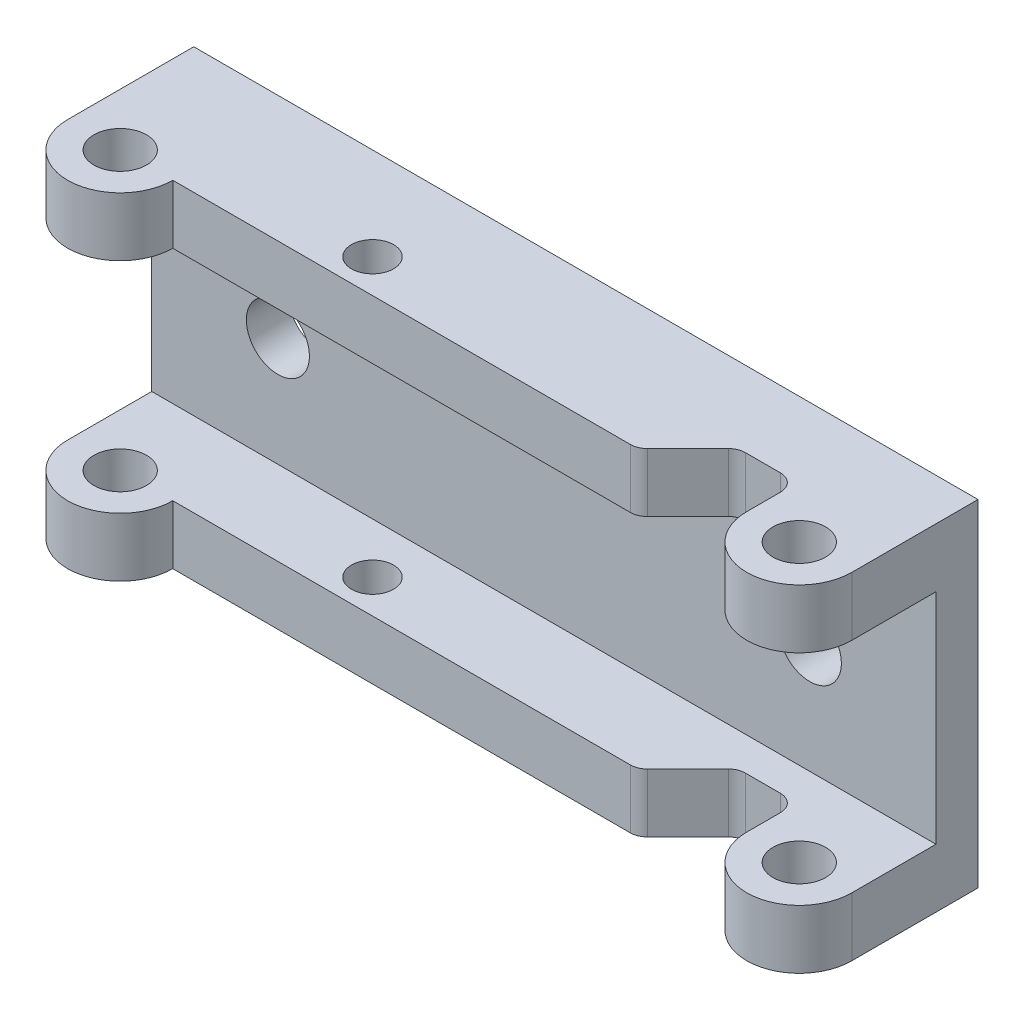
ISO-10303-21;
HEADER;
FILE_DESCRIPTION(('STEP AP214'),'2;1');
FILE_NAME('part.step','',(''),(''),'','','');
FILE_SCHEMA(('AUTOMOTIVE_DESIGN { 1 0 10303 214 1 1 1 1 }'));
ENDSEC;
DATA;
#1=APPLICATION_CONTEXT('core data for automotive mechanical design processes');
#2=APPLICATION_PROTOCOL_DEFINITION('international standard','automotive_design',2000,#1);
#3=PRODUCT_CONTEXT('',#1,'mechanical');
#4=PRODUCT('Part','Part','',(#3));
#5=PRODUCT_RELATED_PRODUCT_CATEGORY('part','',(#4));
#6=PRODUCT_DEFINITION_FORMATION('','',#4);
#7=PRODUCT_DEFINITION_CONTEXT('part definition',#1,'design');
#8=PRODUCT_DEFINITION('design','',#6,#7);
#9=PRODUCT_DEFINITION_SHAPE('','',#8);
#10=(LENGTH_UNIT() NAMED_UNIT(*) SI_UNIT(.MILLI.,.METRE.));
#11=(NAMED_UNIT(*) PLANE_ANGLE_UNIT() SI_UNIT($,.RADIAN.));
#12=(NAMED_UNIT(*) SI_UNIT($,.STERADIAN.) SOLID_ANGLE_UNIT());
#13=UNCERTAINTY_MEASURE_WITH_UNIT(LENGTH_MEASURE(1.E-05),#10,'distance_accuracy_value','');
#14=(GEOMETRIC_REPRESENTATION_CONTEXT(3) GLOBAL_UNCERTAINTY_ASSIGNED_CONTEXT((#13)) GLOBAL_UNIT_ASSIGNED_CONTEXT((#10,
#11,#12)) REPRESENTATION_CONTEXT('',''));
#15=CARTESIAN_POINT('',(0.,0.,0.));
#16=DIRECTION('',(0.,0.,1.));
#17=DIRECTION('',(1.,0.,0.));
#18=AXIS2_PLACEMENT_3D('',#15,#16,#17);
#19=CARTESIAN_POINT('',(118.4275,0.,0.));
#20=DIRECTION('',(1.,0.,0.));
#21=DIRECTION('',(0.,0.,-1.));
#22=AXIS2_PLACEMENT_3D('',#19,#20,#21);
#23=PLANE('',#22);
#24=DIRECTION('',(0.,0.,1.));
#25=VECTOR('',#24,1.);
#26=CARTESIAN_POINT('',(118.4275,25.4,0.));
#27=LINE('',#26,#25);
#28=CARTESIAN_POINT('',(118.4275,25.4,0.));
#29=VERTEX_POINT('',#28);
#30=CARTESIAN_POINT('',(118.4275,25.4,19.05));
#31=VERTEX_POINT('',#30);
#32=EDGE_CURVE('E423',#29,#31,#27,.T.);
#33=ORIENTED_EDGE('',*,*,#32,.T.);
#34=DIRECTION('',(0.,1.,0.));
#35=VECTOR('',#34,1.);
#36=CARTESIAN_POINT('',(118.4275,-154.769075347434,19.05));
#37=LINE('',#36,#35);
#38=CARTESIAN_POINT('',(118.4275,16.51,19.05));
#39=VERTEX_POINT('',#38);
#40=EDGE_CURVE('E12',#31,#39,#37,.F.);
#41=ORIENTED_EDGE('',*,*,#40,.T.);
#42=DIRECTION('',(0.,0.,-1.));
#43=VECTOR('',#42,1.);
#44=CARTESIAN_POINT('',(118.4275,16.51,63.5));
#45=LINE('',#44,#43);
#46=CARTESIAN_POINT('',(118.4275,16.51,6.35));
#47=VERTEX_POINT('',#46);
#48=EDGE_CURVE('E427',#39,#47,#45,.T.);
#49=ORIENTED_EDGE('',*,*,#48,.T.);
#50=DIRECTION('',(0.,-1.,0.));
#51=VECTOR('',#50,1.);
#52=CARTESIAN_POINT('',(118.4275,16.51,6.35));
#53=LINE('',#52,#51);
#54=CARTESIAN_POINT('',(118.4275,-16.51,6.35));
#55=VERTEX_POINT('',#54);
#56=EDGE_CURVE('E431',#47,#55,#53,.T.);
#57=ORIENTED_EDGE('',*,*,#56,.T.);
#58=DIRECTION('',(0.,0.,1.));
#59=VECTOR('',#58,1.);
#60=CARTESIAN_POINT('',(118.4275,-16.51,63.5));
#61=LINE('',#60,#59);
#62=CARTESIAN_POINT('',(118.4275,-16.51,19.05));
#63=VERTEX_POINT('',#62);
#64=EDGE_CURVE('E434',#55,#63,#61,.T.);
#65=ORIENTED_EDGE('',*,*,#64,.T.);
#66=DIRECTION('',(0.,1.,0.));
#67=VECTOR('',#66,1.);
#68=CARTESIAN_POINT('',(118.4275,-154.769075347434,19.05));
#69=LINE('',#68,#67);
#70=CARTESIAN_POINT('',(118.4275,-25.4,19.05));
#71=VERTEX_POINT('',#70);
#72=EDGE_CURVE('E224',#71,#63,#69,.T.);
#73=ORIENTED_EDGE('',*,*,#72,.F.);
#74=DIRECTION('',(0.,0.,-1.));
#75=VECTOR('',#74,1.);
#76=CARTESIAN_POINT('',(118.4275,-25.4,0.));
#77=LINE('',#76,#75);
#78=CARTESIAN_POINT('',(118.4275,-25.4,0.));
#79=VERTEX_POINT('',#78);
#80=EDGE_CURVE('E438',#71,#79,#77,.T.);
#81=ORIENTED_EDGE('',*,*,#80,.T.);
#82=DIRECTION('',(0.,1.,0.));
#83=VECTOR('',#82,1.);
#84=CARTESIAN_POINT('',(118.4275,-25.4,0.));
#85=LINE('',#84,#83);
#86=EDGE_CURVE('E441',#79,#29,#85,.T.);
#87=ORIENTED_EDGE('',*,*,#86,.T.);
#88=EDGE_LOOP('',(#33,#41,#49,#57,#65,#73,#81,#87));
#89=FACE_BOUND('',#88,.T.);
#90=ADVANCED_FACE('F48',(#89),#23,.T.);
#91=CARTESIAN_POINT('',(0.,0.,0.));
#92=DIRECTION('',(1.,0.,0.));
#93=DIRECTION('',(0.,0.,-1.));
#94=AXIS2_PLACEMENT_3D('',#91,#92,#93);
#95=PLANE('',#94);
#96=DIRECTION('',(0.,1.,0.));
#97=VECTOR('',#96,1.);
#98=CARTESIAN_POINT('',(0.,-154.769075347434,19.05));
#99=LINE('',#98,#97);
#100=CARTESIAN_POINT('',(0.,25.4,19.05));
#101=VERTEX_POINT('',#100);
#102=CARTESIAN_POINT('',(0.,16.51,19.05));
#103=VERTEX_POINT('',#102);
#104=EDGE_CURVE('E57',#101,#103,#99,.F.);
#105=ORIENTED_EDGE('',*,*,#104,.F.);
#106=DIRECTION('',(0.,0.,1.));
#107=VECTOR('',#106,1.);
#108=CARTESIAN_POINT('',(0.,25.4,0.));
#109=LINE('',#108,#107);
#110=CARTESIAN_POINT('',(0.,25.4,0.));
#111=VERTEX_POINT('',#110);
#112=EDGE_CURVE('E422',#111,#101,#109,.T.);
#113=ORIENTED_EDGE('',*,*,#112,.F.);
#114=DIRECTION('',(0.,1.,0.));
#115=VECTOR('',#114,1.);
#116=CARTESIAN_POINT('',(0.,-25.4,0.));
#117=LINE('',#116,#115);
#118=CARTESIAN_POINT('',(0.,-25.4,0.));
#119=VERTEX_POINT('',#118);
#120=EDGE_CURVE('E428',#119,#111,#117,.T.);
#121=ORIENTED_EDGE('',*,*,#120,.F.);
#122=DIRECTION('',(0.,0.,-1.));
#123=VECTOR('',#122,1.);
#124=CARTESIAN_POINT('',(0.,-25.4,0.));
#125=LINE('',#124,#123);
#126=CARTESIAN_POINT('',(0.,-25.4,19.05));
#127=VERTEX_POINT('',#126);
#128=EDGE_CURVE('E458',#127,#119,#125,.T.);
#129=ORIENTED_EDGE('',*,*,#128,.F.);
#130=DIRECTION('',(0.,1.,0.));
#131=VECTOR('',#130,1.);
#132=CARTESIAN_POINT('',(0.,-154.769075347434,19.05));
#133=LINE('',#132,#131);
#134=CARTESIAN_POINT('',(0.,-16.51,19.05));
#135=VERTEX_POINT('',#134);
#136=EDGE_CURVE('E281',#127,#135,#133,.T.);
#137=ORIENTED_EDGE('',*,*,#136,.T.);
#138=DIRECTION('',(0.,0.,1.));
#139=VECTOR('',#138,1.);
#140=CARTESIAN_POINT('',(0.,-16.51,63.5));
#141=LINE('',#140,#139);
#142=CARTESIAN_POINT('',(0.,-16.51,6.35));
#143=VERTEX_POINT('',#142);
#144=EDGE_CURVE('E454',#143,#135,#141,.T.);
#145=ORIENTED_EDGE('',*,*,#144,.F.);
#146=DIRECTION('',(0.,-1.,0.));
#147=VECTOR('',#146,1.);
#148=CARTESIAN_POINT('',(0.,16.51,6.35));
#149=LINE('',#148,#147);
#150=CARTESIAN_POINT('',(0.,16.51,6.35));
#151=VERTEX_POINT('',#150);
#152=EDGE_CURVE('E451',#151,#143,#149,.T.);
#153=ORIENTED_EDGE('',*,*,#152,.F.);
#154=DIRECTION('',(0.,0.,-1.));
#155=VECTOR('',#154,1.);
#156=CARTESIAN_POINT('',(0.,16.51,63.5));
#157=LINE('',#156,#155);
#158=EDGE_CURVE('E448',#103,#151,#157,.T.);
#159=ORIENTED_EDGE('',*,*,#158,.F.);
#160=EDGE_LOOP('',(#105,#113,#121,#129,#137,#145,#153,#159));
#161=FACE_BOUND('',#160,.T.);
#162=ADVANCED_FACE('F489',(#161),#95,.F.);
#163=CARTESIAN_POINT('',(118.4275,25.4,0.));
#164=DIRECTION('',(0.,-1.,0.));
#165=DIRECTION('',(0.,0.,-1.));
#166=AXIS2_PLACEMENT_3D('',#163,#164,#165);
#167=PLANE('',#166);
#168=CARTESIAN_POINT('',(110.49,25.4,19.05));
#169=DIRECTION('',(0.,-1.,0.));
#170=DIRECTION('',(0.,0.,-1.));
#171=AXIS2_PLACEMENT_3D('',#168,#169,#170);
#172=CIRCLE('',#171,3.96875000000001);
#173=CARTESIAN_POINT('',(110.49,25.4,15.08125));
#174=VERTEX_POINT('',#173);
#175=EDGE_CURVE('E315',#174,#174,#172,.T.);
#176=ORIENTED_EDGE('',*,*,#175,.T.);
#177=EDGE_LOOP('',(#176));
#178=FACE_BOUND('',#177,.T.);
#179=CARTESIAN_POINT('',(40.9575,25.4,13.97));
#180=DIRECTION('',(0.,-1.,0.));
#181=DIRECTION('',(0.,0.,-1.));
#182=AXIS2_PLACEMENT_3D('',#179,#180,#181);
#183=CIRCLE('',#182,3.175);
#184=CARTESIAN_POINT('',(40.9575,25.4,10.795));
#185=VERTEX_POINT('',#184);
#186=EDGE_CURVE('E242',#185,#185,#183,.T.);
#187=ORIENTED_EDGE('',*,*,#186,.T.);
#188=EDGE_LOOP('',(#187));
#189=FACE_BOUND('',#188,.T.);
#190=CARTESIAN_POINT('',(7.9375,25.4,19.05));
#191=DIRECTION('',(0.,-1.,0.));
#192=DIRECTION('',(0.,0.,-1.));
#193=AXIS2_PLACEMENT_3D('',#190,#191,#192);
#194=CIRCLE('',#193,3.96875000000001);
#195=CARTESIAN_POINT('',(7.9375,25.4,15.08125));
#196=VERTEX_POINT('',#195);
#197=EDGE_CURVE('E323',#196,#196,#194,.T.);
#198=ORIENTED_EDGE('',*,*,#197,.T.);
#199=EDGE_LOOP('',(#198));
#200=FACE_BOUND('',#199,.T.);
#201=DIRECTION('',(0.,0.,1.));
#202=VECTOR('',#201,1.);
#203=CARTESIAN_POINT('',(102.5525,25.4,19.05));
#204=LINE('',#203,#202);
#205=CARTESIAN_POINT('',(102.5525,25.4,13.97));
#206=VERTEX_POINT('',#205);
#207=CARTESIAN_POINT('',(102.5525,25.4,19.05));
#208=VERTEX_POINT('',#207);
#209=EDGE_CURVE('E216',#206,#208,#204,.T.);
#210=ORIENTED_EDGE('',*,*,#209,.T.);
#211=CARTESIAN_POINT('',(110.49,25.4,19.05));
#212=DIRECTION('',(0.,-1.,0.));
#213=DIRECTION('',(0.,0.,-1.));
#214=AXIS2_PLACEMENT_3D('',#211,#212,#213);
#215=CIRCLE('',#214,7.9375);
#216=EDGE_CURVE('E227',#208,#31,#215,.F.);
#217=ORIENTED_EDGE('',*,*,#216,.T.);
#218=ORIENTED_EDGE('',*,*,#32,.F.);
#219=DIRECTION('',(-1.,0.,0.));
#220=VECTOR('',#219,1.);
#221=CARTESIAN_POINT('',(118.4275,25.4,0.));
#222=LINE('',#221,#220);
#223=EDGE_CURVE('E443',#29,#111,#222,.T.);
#224=ORIENTED_EDGE('',*,*,#223,.T.);
#225=ORIENTED_EDGE('',*,*,#112,.T.);
#226=CARTESIAN_POINT('',(7.9375,25.4,19.05));
#227=DIRECTION('',(0.,-1.,0.));
#228=DIRECTION('',(0.,0.,-1.));
#229=AXIS2_PLACEMENT_3D('',#226,#227,#228);
#230=CIRCLE('',#229,7.9375);
#231=CARTESIAN_POINT('',(15.875,25.4,19.05));
#232=VERTEX_POINT('',#231);
#233=EDGE_CURVE('E72',#101,#232,#230,.F.);
#234=ORIENTED_EDGE('',*,*,#233,.T.);
#235=DIRECTION('',(1.,0.,0.));
#236=VECTOR('',#235,1.);
#237=CARTESIAN_POINT('',(15.875,25.4,19.05));
#238=LINE('',#237,#236);
#239=CARTESIAN_POINT('',(84.9903975515723,25.4,19.05));
#240=VERTEX_POINT('',#239);
#241=EDGE_CURVE('E526',#232,#240,#238,.T.);
#242=ORIENTED_EDGE('',*,*,#241,.T.);
#243=CARTESIAN_POINT('',(84.9903975515723,25.4,16.51));
#244=DIRECTION('',(0.,-1.,0.));
#245=DIRECTION('',(0.,0.,-1.));
#246=AXIS2_PLACEMENT_3D('',#243,#244,#245);
#247=CIRCLE('',#246,2.54000000000001);
#248=CARTESIAN_POINT('',(86.7864487757861,25.4,18.3060512242138));
#249=VERTEX_POINT('',#248);
#250=EDGE_CURVE('E522',#240,#249,#247,.F.);
#251=ORIENTED_EDGE('',*,*,#250,.T.);
#252=DIRECTION('',(0.707106781186551,0.,-0.707106781186544));
#253=VECTOR('',#252,1.);
#254=CARTESIAN_POINT('',(86.7864487757861,25.4,18.3060512242138));
#255=LINE('',#254,#253);
#256=CARTESIAN_POINT('',(92.9185512242138,25.4,12.1739487757862));
#257=VERTEX_POINT('',#256);
#258=EDGE_CURVE('E518',#249,#257,#255,.T.);
#259=ORIENTED_EDGE('',*,*,#258,.T.);
#260=CARTESIAN_POINT('',(94.7146024484277,25.4,13.97));
#261=DIRECTION('',(0.,-1.,0.));
#262=DIRECTION('',(0.,0.,-1.));
#263=AXIS2_PLACEMENT_3D('',#260,#261,#262);
#264=CIRCLE('',#263,2.54);
#265=CARTESIAN_POINT('',(94.7146024484277,25.4,11.43));
#266=VERTEX_POINT('',#265);
#267=EDGE_CURVE('E515',#257,#266,#264,.T.);
#268=ORIENTED_EDGE('',*,*,#267,.T.);
#269=DIRECTION('',(1.,0.,0.));
#270=VECTOR('',#269,1.);
#271=CARTESIAN_POINT('',(100.0125,25.4,11.43));
#272=LINE('',#271,#270);
#273=CARTESIAN_POINT('',(100.0125,25.4,11.43));
#274=VERTEX_POINT('',#273);
#275=EDGE_CURVE('E513',#266,#274,#272,.T.);
#276=ORIENTED_EDGE('',*,*,#275,.T.);
#277=CARTESIAN_POINT('',(100.0125,25.4,13.97));
#278=DIRECTION('',(0.,-1.,0.));
#279=DIRECTION('',(0.,0.,-1.));
#280=AXIS2_PLACEMENT_3D('',#277,#278,#279);
#281=CIRCLE('',#280,2.54);
#282=EDGE_CURVE('E236',#274,#206,#281,.T.);
#283=ORIENTED_EDGE('',*,*,#282,.T.);
#284=EDGE_LOOP('',(#210,#217,#218,#224,#225,#234,#242,#251,#259,#268,#276,#283));
#285=FACE_BOUND('',#284,.T.);
#286=ADVANCED_FACE('F50',(#178,#189,#200,#285),#167,.F.);
#287=CARTESIAN_POINT('',(118.4275,16.51,63.5));
#288=DIRECTION('',(0.,1.,0.));
#289=DIRECTION('',(0.,0.,1.));
#290=AXIS2_PLACEMENT_3D('',#287,#288,#289);
#291=PLANE('',#290);
#292=ORIENTED_EDGE('',*,*,#48,.F.);
#293=CARTESIAN_POINT('',(110.49,16.51,19.05));
#294=DIRECTION('',(0.,1.,0.));
#295=DIRECTION('',(0.,0.,1.));
#296=AXIS2_PLACEMENT_3D('',#293,#294,#295);
#297=CIRCLE('',#296,7.9375);
#298=CARTESIAN_POINT('',(102.5525,16.51,19.05));
#299=VERTEX_POINT('',#298);
#300=EDGE_CURVE('E341',#39,#299,#297,.F.);
#301=ORIENTED_EDGE('',*,*,#300,.T.);
#302=DIRECTION('',(0.,0.,-1.));
#303=VECTOR('',#302,1.);
#304=CARTESIAN_POINT('',(102.5525,16.51,63.5));
#305=LINE('',#304,#303);
#306=CARTESIAN_POINT('',(102.5525,16.51,13.97));
#307=VERTEX_POINT('',#306);
#308=EDGE_CURVE('E219',#299,#307,#305,.T.);
#309=ORIENTED_EDGE('',*,*,#308,.T.);
#310=CARTESIAN_POINT('',(100.0125,16.51,13.97));
#311=DIRECTION('',(0.,1.,0.));
#312=DIRECTION('',(0.,0.,1.));
#313=AXIS2_PLACEMENT_3D('',#310,#311,#312);
#314=CIRCLE('',#313,2.54);
#315=CARTESIAN_POINT('',(100.0125,16.51,11.43));
#316=VERTEX_POINT('',#315);
#317=EDGE_CURVE('E418',#307,#316,#314,.T.);
#318=ORIENTED_EDGE('',*,*,#317,.T.);
#319=DIRECTION('',(-1.,0.,0.));
#320=VECTOR('',#319,1.);
#321=CARTESIAN_POINT('',(118.4275,16.51,11.43));
#322=LINE('',#321,#320);
#323=CARTESIAN_POINT('',(94.7146024484277,16.51,11.43));
#324=VERTEX_POINT('',#323);
#325=EDGE_CURVE('E372',#316,#324,#322,.T.);
#326=ORIENTED_EDGE('',*,*,#325,.T.);
#327=CARTESIAN_POINT('',(94.7146024484277,16.51,13.97));
#328=DIRECTION('',(0.,1.,0.));
#329=DIRECTION('',(0.,0.,1.));
#330=AXIS2_PLACEMENT_3D('',#327,#328,#329);
#331=CIRCLE('',#330,2.54);
#332=CARTESIAN_POINT('',(92.9185512242138,16.51,12.1739487757862));
#333=VERTEX_POINT('',#332);
#334=EDGE_CURVE('E380',#324,#333,#331,.T.);
#335=ORIENTED_EDGE('',*,*,#334,.T.);
#336=DIRECTION('',(-0.707106781186551,0.,0.707106781186544));
#337=VECTOR('',#336,1.);
#338=CARTESIAN_POINT('',(80.0100000000001,16.51,25.0824999999997));
#339=LINE('',#338,#337);
#340=CARTESIAN_POINT('',(86.7864487757861,16.51,18.3060512242138));
#341=VERTEX_POINT('',#340);
#342=EDGE_CURVE('E388',#333,#341,#339,.T.);
#343=ORIENTED_EDGE('',*,*,#342,.T.);
#344=CARTESIAN_POINT('',(84.9903975515723,16.51,16.51));
#345=DIRECTION('',(0.,1.,0.));
#346=DIRECTION('',(0.,0.,1.));
#347=AXIS2_PLACEMENT_3D('',#344,#345,#346);
#348=CIRCLE('',#347,2.54000000000001);
#349=CARTESIAN_POINT('',(84.9903975515723,16.51,19.05));
#350=VERTEX_POINT('',#349);
#351=EDGE_CURVE('E396',#341,#350,#348,.F.);
#352=ORIENTED_EDGE('',*,*,#351,.T.);
#353=DIRECTION('',(-1.,0.,0.));
#354=VECTOR('',#353,1.);
#355=CARTESIAN_POINT('',(118.4275,16.51,19.05));
#356=LINE('',#355,#354);
#357=CARTESIAN_POINT('',(15.875,16.51,19.05));
#358=VERTEX_POINT('',#357);
#359=EDGE_CURVE('E404',#350,#358,#356,.T.);
#360=ORIENTED_EDGE('',*,*,#359,.T.);
#361=CARTESIAN_POINT('',(7.9375,16.51,19.05));
#362=DIRECTION('',(0.,1.,0.));
#363=DIRECTION('',(0.,0.,1.));
#364=AXIS2_PLACEMENT_3D('',#361,#362,#363);
#365=CIRCLE('',#364,7.9375);
#366=EDGE_CURVE('E333',#358,#103,#365,.F.);
#367=ORIENTED_EDGE('',*,*,#366,.T.);
#368=ORIENTED_EDGE('',*,*,#158,.T.);
#369=DIRECTION('',(-1.,0.,0.));
#370=VECTOR('',#369,1.);
#371=CARTESIAN_POINT('',(118.4275,16.51,6.35));
#372=LINE('',#371,#370);
#373=EDGE_CURVE('E474',#47,#151,#372,.T.);
#374=ORIENTED_EDGE('',*,*,#373,.F.);
#375=EDGE_LOOP('',(#292,#301,#309,#318,#326,#335,#343,#352,#360,#367,#368,#374));
#376=FACE_BOUND('',#375,.T.);
#377=CARTESIAN_POINT('',(110.49,16.51,19.05));
#378=DIRECTION('',(0.,1.,0.));
#379=DIRECTION('',(0.,0.,1.));
#380=AXIS2_PLACEMENT_3D('',#377,#378,#379);
#381=CIRCLE('',#380,3.96875000000001);
#382=CARTESIAN_POINT('',(110.49,16.51,23.01875));
#383=VERTEX_POINT('',#382);
#384=EDGE_CURVE('E364',#383,#383,#381,.T.);
#385=ORIENTED_EDGE('',*,*,#384,.T.);
#386=EDGE_LOOP('',(#385));
#387=FACE_BOUND('',#386,.T.);
#388=CARTESIAN_POINT('',(40.9575,16.51,13.97));
#389=DIRECTION('',(0.,1.,0.));
#390=DIRECTION('',(0.,0.,1.));
#391=AXIS2_PLACEMENT_3D('',#388,#389,#390);
#392=CIRCLE('',#391,3.175);
#393=CARTESIAN_POINT('',(40.9575,16.51,17.145));
#394=VERTEX_POINT('',#393);
#395=EDGE_CURVE('E356',#394,#394,#392,.T.);
#396=ORIENTED_EDGE('',*,*,#395,.T.);
#397=EDGE_LOOP('',(#396));
#398=FACE_BOUND('',#397,.T.);
#399=CARTESIAN_POINT('',(7.9375,16.51,19.05));
#400=DIRECTION('',(0.,1.,0.));
#401=DIRECTION('',(0.,0.,1.));
#402=AXIS2_PLACEMENT_3D('',#399,#400,#401);
#403=CIRCLE('',#402,3.96875000000001);
#404=CARTESIAN_POINT('',(7.9375,16.51,23.01875));
#405=VERTEX_POINT('',#404);
#406=EDGE_CURVE('E348',#405,#405,#403,.T.);
#407=ORIENTED_EDGE('',*,*,#406,.T.);
#408=EDGE_LOOP('',(#407));
#409=FACE_BOUND('',#408,.T.);
#410=ADVANCED_FACE('F485',(#376,#387,#398,#409),#291,.F.);
#411=CARTESIAN_POINT('',(118.4275,16.51,6.35));
#412=DIRECTION('',(0.,0.,-1.));
#413=DIRECTION('',(-1.,0.,0.));
#414=AXIS2_PLACEMENT_3D('',#411,#412,#413);
#415=PLANE('',#414);
#416=CARTESIAN_POINT('',(19.05,0.,6.35));
#417=DIRECTION('',(0.,0.,-1.));
#418=DIRECTION('',(-1.,0.,0.));
#419=AXIS2_PLACEMENT_3D('',#416,#417,#418);
#420=CIRCLE('',#419,4.7625);
#421=CARTESIAN_POINT('',(14.2875,0.,6.35));
#422=VERTEX_POINT('',#421);
#423=EDGE_CURVE('E536',#422,#422,#420,.T.);
#424=ORIENTED_EDGE('',*,*,#423,.T.);
#425=EDGE_LOOP('',(#424));
#426=FACE_BOUND('',#425,.T.);
#427=CARTESIAN_POINT('',(99.3775,0.,6.35));
#428=DIRECTION('',(0.,0.,-1.));
#429=DIRECTION('',(-1.,0.,0.));
#430=AXIS2_PLACEMENT_3D('',#427,#428,#429);
#431=CIRCLE('',#430,4.76250000000001);
#432=CARTESIAN_POINT('',(94.615,0.,6.35));
#433=VERTEX_POINT('',#432);
#434=EDGE_CURVE('E537',#433,#433,#431,.T.);
#435=ORIENTED_EDGE('',*,*,#434,.T.);
#436=EDGE_LOOP('',(#435));
#437=FACE_BOUND('',#436,.T.);
#438=ORIENTED_EDGE('',*,*,#152,.T.);
#439=DIRECTION('',(-1.,0.,0.));
#440=VECTOR('',#439,1.);
#441=CARTESIAN_POINT('',(118.4275,-16.51,6.35));
#442=LINE('',#441,#440);
#443=EDGE_CURVE('E470',#55,#143,#442,.T.);
#444=ORIENTED_EDGE('',*,*,#443,.F.);
#445=ORIENTED_EDGE('',*,*,#56,.F.);
#446=ORIENTED_EDGE('',*,*,#373,.T.);
#447=EDGE_LOOP('',(#438,#444,#445,#446));
#448=FACE_BOUND('',#447,.T.);
#449=ADVANCED_FACE('F493',(#426,#437,#448),#415,.F.);
#450=CARTESIAN_POINT('',(118.4275,-16.51,63.5));
#451=DIRECTION('',(0.,-1.,0.));
#452=DIRECTION('',(0.,0.,-1.));
#453=AXIS2_PLACEMENT_3D('',#450,#451,#452);
#454=PLANE('',#453);
#455=CARTESIAN_POINT('',(110.49,-16.51,19.05));
#456=DIRECTION('',(0.,-1.,0.));
#457=DIRECTION('',(0.,0.,-1.));
#458=AXIS2_PLACEMENT_3D('',#455,#456,#457);
#459=CIRCLE('',#458,3.96875000000001);
#460=CARTESIAN_POINT('',(110.49,-16.51,15.08125));
#461=VERTEX_POINT('',#460);
#462=EDGE_CURVE('E360',#461,#461,#459,.T.);
#463=ORIENTED_EDGE('',*,*,#462,.T.);
#464=EDGE_LOOP('',(#463));
#465=FACE_BOUND('',#464,.T.);
#466=CARTESIAN_POINT('',(40.9575,-16.51,13.97));
#467=DIRECTION('',(0.,-1.,0.));
#468=DIRECTION('',(0.,0.,-1.));
#469=AXIS2_PLACEMENT_3D('',#466,#467,#468);
#470=CIRCLE('',#469,3.175);
#471=CARTESIAN_POINT('',(40.9575,-16.51,10.795));
#472=VERTEX_POINT('',#471);
#473=EDGE_CURVE('E352',#472,#472,#470,.T.);
#474=ORIENTED_EDGE('',*,*,#473,.T.);
#475=EDGE_LOOP('',(#474));
#476=FACE_BOUND('',#475,.T.);
#477=CARTESIAN_POINT('',(7.9375,-16.51,19.05));
#478=DIRECTION('',(0.,-1.,0.));
#479=DIRECTION('',(0.,0.,-1.));
#480=AXIS2_PLACEMENT_3D('',#477,#478,#479);
#481=CIRCLE('',#480,3.96875000000001);
#482=CARTESIAN_POINT('',(7.9375,-16.51,15.08125));
#483=VERTEX_POINT('',#482);
#484=EDGE_CURVE('E344',#483,#483,#481,.T.);
#485=ORIENTED_EDGE('',*,*,#484,.T.);
#486=EDGE_LOOP('',(#485));
#487=FACE_BOUND('',#486,.T.);
#488=DIRECTION('',(0.,0.,1.));
#489=VECTOR('',#488,1.);
#490=CARTESIAN_POINT('',(102.5525,-16.51,63.5));
#491=LINE('',#490,#489);
#492=CARTESIAN_POINT('',(102.5525,-16.51,13.97));
#493=VERTEX_POINT('',#492);
#494=CARTESIAN_POINT('',(102.5525,-16.51,19.05));
#495=VERTEX_POINT('',#494);
#496=EDGE_CURVE('E408',#493,#495,#491,.T.);
#497=ORIENTED_EDGE('',*,*,#496,.T.);
#498=CARTESIAN_POINT('',(110.49,-16.51,19.05));
#499=DIRECTION('',(0.,-1.,0.));
#500=DIRECTION('',(0.,0.,-1.));
#501=AXIS2_PLACEMENT_3D('',#498,#499,#500);
#502=CIRCLE('',#501,7.9375);
#503=EDGE_CURVE('E337',#495,#63,#502,.F.);
#504=ORIENTED_EDGE('',*,*,#503,.T.);
#505=ORIENTED_EDGE('',*,*,#64,.F.);
#506=ORIENTED_EDGE('',*,*,#443,.T.);
#507=ORIENTED_EDGE('',*,*,#144,.T.);
#508=CARTESIAN_POINT('',(7.9375,-16.51,19.05));
#509=DIRECTION('',(0.,-1.,0.));
#510=DIRECTION('',(0.,0.,-1.));
#511=AXIS2_PLACEMENT_3D('',#508,#509,#510);
#512=CIRCLE('',#511,7.9375);
#513=CARTESIAN_POINT('',(15.875,-16.51,19.05));
#514=VERTEX_POINT('',#513);
#515=EDGE_CURVE('E64',#135,#514,#512,.F.);
#516=ORIENTED_EDGE('',*,*,#515,.T.);
#517=DIRECTION('',(1.,0.,0.));
#518=VECTOR('',#517,1.);
#519=CARTESIAN_POINT('',(118.4275,-16.51,19.05));
#520=LINE('',#519,#518);
#521=CARTESIAN_POINT('',(84.9903975515723,-16.51,19.05));
#522=VERTEX_POINT('',#521);
#523=EDGE_CURVE('E400',#514,#522,#520,.T.);
#524=ORIENTED_EDGE('',*,*,#523,.T.);
#525=CARTESIAN_POINT('',(84.9903975515723,-16.51,16.51));
#526=DIRECTION('',(0.,-1.,0.));
#527=DIRECTION('',(0.,0.,-1.));
#528=AXIS2_PLACEMENT_3D('',#525,#526,#527);
#529=CIRCLE('',#528,2.54000000000001);
#530=CARTESIAN_POINT('',(86.7864487757861,-16.51,18.3060512242138));
#531=VERTEX_POINT('',#530);
#532=EDGE_CURVE('E392',#522,#531,#529,.F.);
#533=ORIENTED_EDGE('',*,*,#532,.T.);
#534=DIRECTION('',(0.707106781186551,0.,-0.707106781186544));
#535=VECTOR('',#534,1.);
#536=CARTESIAN_POINT('',(80.0100000000001,-16.51,25.0824999999997));
#537=LINE('',#536,#535);
#538=CARTESIAN_POINT('',(92.9185512242138,-16.51,12.1739487757862));
#539=VERTEX_POINT('',#538);
#540=EDGE_CURVE('E384',#531,#539,#537,.T.);
#541=ORIENTED_EDGE('',*,*,#540,.T.);
#542=CARTESIAN_POINT('',(94.7146024484277,-16.51,13.97));
#543=DIRECTION('',(0.,-1.,0.));
#544=DIRECTION('',(0.,0.,-1.));
#545=AXIS2_PLACEMENT_3D('',#542,#543,#544);
#546=CIRCLE('',#545,2.54);
#547=CARTESIAN_POINT('',(94.7146024484277,-16.51,11.43));
#548=VERTEX_POINT('',#547);
#549=EDGE_CURVE('E376',#539,#548,#546,.T.);
#550=ORIENTED_EDGE('',*,*,#549,.T.);
#551=DIRECTION('',(1.,0.,0.));
#552=VECTOR('',#551,1.);
#553=CARTESIAN_POINT('',(118.4275,-16.51,11.43));
#554=LINE('',#553,#552);
#555=CARTESIAN_POINT('',(100.0125,-16.51,11.43));
#556=VERTEX_POINT('',#555);
#557=EDGE_CURVE('E368',#548,#556,#554,.T.);
#558=ORIENTED_EDGE('',*,*,#557,.T.);
#559=CARTESIAN_POINT('',(100.0125,-16.51,13.97));
#560=DIRECTION('',(0.,-1.,0.));
#561=DIRECTION('',(0.,0.,-1.));
#562=AXIS2_PLACEMENT_3D('',#559,#560,#561);
#563=CIRCLE('',#562,2.54);
#564=EDGE_CURVE('E414',#556,#493,#563,.T.);
#565=ORIENTED_EDGE('',*,*,#564,.T.);
#566=EDGE_LOOP('',(#497,#504,#505,#506,#507,#516,#524,#533,#541,#550,#558,#565));
#567=FACE_BOUND('',#566,.T.);
#568=ADVANCED_FACE('F497',(#465,#476,#487,#567),#454,.F.);
#569=CARTESIAN_POINT('',(118.4275,-25.4,0.));
#570=DIRECTION('',(0.,1.,0.));
#571=DIRECTION('',(0.,0.,1.));
#572=AXIS2_PLACEMENT_3D('',#569,#570,#571);
#573=PLANE('',#572);
#574=ORIENTED_EDGE('',*,*,#80,.F.);
#575=CARTESIAN_POINT('',(110.49,-25.4,19.05));
#576=DIRECTION('',(0.,1.,0.));
#577=DIRECTION('',(0.,0.,1.));
#578=AXIS2_PLACEMENT_3D('',#575,#576,#577);
#579=CIRCLE('',#578,7.9375);
#580=CARTESIAN_POINT('',(102.5525,-25.4,19.05));
#581=VERTEX_POINT('',#580);
#582=EDGE_CURVE('E263',#581,#71,#579,.T.);
#583=ORIENTED_EDGE('',*,*,#582,.F.);
#584=DIRECTION('',(0.,0.,1.));
#585=VECTOR('',#584,1.);
#586=CARTESIAN_POINT('',(102.5525,-25.4,19.05));
#587=LINE('',#586,#585);
#588=CARTESIAN_POINT('',(102.5525,-25.4,13.97));
#589=VERTEX_POINT('',#588);
#590=EDGE_CURVE('E266',#589,#581,#587,.T.);
#591=ORIENTED_EDGE('',*,*,#590,.F.);
#592=CARTESIAN_POINT('',(100.0125,-25.4,13.97));
#593=DIRECTION('',(0.,1.,0.));
#594=DIRECTION('',(0.,0.,1.));
#595=AXIS2_PLACEMENT_3D('',#592,#593,#594);
#596=CIRCLE('',#595,2.54);
#597=CARTESIAN_POINT('',(100.0125,-25.4,11.43));
#598=VERTEX_POINT('',#597);
#599=EDGE_CURVE('E269',#598,#589,#596,.F.);
#600=ORIENTED_EDGE('',*,*,#599,.F.);
#601=DIRECTION('',(1.,0.,0.));
#602=VECTOR('',#601,1.);
#603=CARTESIAN_POINT('',(100.0125,-25.4,11.43));
#604=LINE('',#603,#602);
#605=CARTESIAN_POINT('',(94.7146024484277,-25.4,11.43));
#606=VERTEX_POINT('',#605);
#607=EDGE_CURVE('E272',#606,#598,#604,.T.);
#608=ORIENTED_EDGE('',*,*,#607,.F.);
#609=CARTESIAN_POINT('',(94.7146024484277,-25.4,13.97));
#610=DIRECTION('',(0.,1.,0.));
#611=DIRECTION('',(0.,0.,1.));
#612=AXIS2_PLACEMENT_3D('',#609,#610,#611);
#613=CIRCLE('',#612,2.54);
#614=CARTESIAN_POINT('',(92.9185512242138,-25.4,12.1739487757862));
#615=VERTEX_POINT('',#614);
#616=EDGE_CURVE('E247',#615,#606,#613,.F.);
#617=ORIENTED_EDGE('',*,*,#616,.F.);
#618=DIRECTION('',(0.707106781186551,0.,-0.707106781186544));
#619=VECTOR('',#618,1.);
#620=CARTESIAN_POINT('',(86.7864487757861,-25.4,18.3060512242138));
#621=LINE('',#620,#619);
#622=CARTESIAN_POINT('',(86.7864487757861,-25.4,18.3060512242138));
#623=VERTEX_POINT('',#622);
#624=EDGE_CURVE('E250',#623,#615,#621,.T.);
#625=ORIENTED_EDGE('',*,*,#624,.F.);
#626=CARTESIAN_POINT('',(84.9903975515723,-25.4,16.51));
#627=DIRECTION('',(0.,1.,0.));
#628=DIRECTION('',(0.,0.,1.));
#629=AXIS2_PLACEMENT_3D('',#626,#627,#628);
#630=CIRCLE('',#629,2.54000000000001);
#631=CARTESIAN_POINT('',(84.9903975515723,-25.4,19.05));
#632=VERTEX_POINT('',#631);
#633=EDGE_CURVE('E254',#632,#623,#630,.T.);
#634=ORIENTED_EDGE('',*,*,#633,.F.);
#635=DIRECTION('',(1.,0.,0.));
#636=VECTOR('',#635,1.);
#637=CARTESIAN_POINT('',(15.875,-25.4,19.05));
#638=LINE('',#637,#636);
#639=CARTESIAN_POINT('',(15.875,-25.4,19.05));
#640=VERTEX_POINT('',#639);
#641=EDGE_CURVE('E257',#640,#632,#638,.T.);
#642=ORIENTED_EDGE('',*,*,#641,.F.);
#643=CARTESIAN_POINT('',(7.9375,-25.4,19.05));
#644=DIRECTION('',(0.,1.,0.));
#645=DIRECTION('',(0.,0.,1.));
#646=AXIS2_PLACEMENT_3D('',#643,#644,#645);
#647=CIRCLE('',#646,7.9375);
#648=EDGE_CURVE('E260',#127,#640,#647,.T.);
#649=ORIENTED_EDGE('',*,*,#648,.F.);
#650=ORIENTED_EDGE('',*,*,#128,.T.);
#651=DIRECTION('',(-1.,0.,0.));
#652=VECTOR('',#651,1.);
#653=CARTESIAN_POINT('',(118.4275,-25.4,0.));
#654=LINE('',#653,#652);
#655=EDGE_CURVE('E466',#79,#119,#654,.T.);
#656=ORIENTED_EDGE('',*,*,#655,.F.);
#657=EDGE_LOOP('',(#574,#583,#591,#600,#608,#617,#625,#634,#642,#649,#650,#656));
#658=FACE_BOUND('',#657,.T.);
#659=CARTESIAN_POINT('',(110.49,-25.4,19.05));
#660=DIRECTION('',(0.,1.,0.));
#661=DIRECTION('',(0.,0.,1.));
#662=AXIS2_PLACEMENT_3D('',#659,#660,#661);
#663=CIRCLE('',#662,3.96875000000001);
#664=CARTESIAN_POINT('',(110.49,-25.4,23.01875));
#665=VERTEX_POINT('',#664);
#666=EDGE_CURVE('E319',#665,#665,#663,.F.);
#667=ORIENTED_EDGE('',*,*,#666,.F.);
#668=EDGE_LOOP('',(#667));
#669=FACE_BOUND('',#668,.T.);
#670=CARTESIAN_POINT('',(40.9575,-25.4,13.97));
#671=DIRECTION('',(0.,1.,0.));
#672=DIRECTION('',(0.,0.,1.));
#673=AXIS2_PLACEMENT_3D('',#670,#671,#672);
#674=CIRCLE('',#673,3.175);
#675=CARTESIAN_POINT('',(40.9575,-25.4,17.145));
#676=VERTEX_POINT('',#675);
#677=EDGE_CURVE('E238',#676,#676,#674,.F.);
#678=ORIENTED_EDGE('',*,*,#677,.F.);
#679=EDGE_LOOP('',(#678));
#680=FACE_BOUND('',#679,.T.);
#681=CARTESIAN_POINT('',(7.9375,-25.4,19.05));
#682=DIRECTION('',(0.,1.,0.));
#683=DIRECTION('',(0.,0.,1.));
#684=AXIS2_PLACEMENT_3D('',#681,#682,#683);
#685=CIRCLE('',#684,3.96875000000001);
#686=CARTESIAN_POINT('',(7.9375,-25.4,23.01875));
#687=VERTEX_POINT('',#686);
#688=EDGE_CURVE('E327',#687,#687,#685,.F.);
#689=ORIENTED_EDGE('',*,*,#688,.F.);
#690=EDGE_LOOP('',(#689));
#691=FACE_BOUND('',#690,.T.);
#692=ADVANCED_FACE('F581',(#658,#669,#680,#691),#573,.F.);
#693=CARTESIAN_POINT('',(118.4275,-25.4,0.));
#694=DIRECTION('',(0.,0.,1.));
#695=DIRECTION('',(1.,0.,0.));
#696=AXIS2_PLACEMENT_3D('',#693,#694,#695);
#697=PLANE('',#696);
#698=CARTESIAN_POINT('',(19.05,0.,0.));
#699=DIRECTION('',(0.,0.,1.));
#700=DIRECTION('',(1.,0.,0.));
#701=AXIS2_PLACEMENT_3D('',#698,#699,#700);
#702=CIRCLE('',#701,4.7625);
#703=CARTESIAN_POINT('',(23.8125,0.,0.));
#704=VERTEX_POINT('',#703);
#705=EDGE_CURVE('E541',#704,#704,#702,.T.);
#706=ORIENTED_EDGE('',*,*,#705,.T.);
#707=EDGE_LOOP('',(#706));
#708=FACE_BOUND('',#707,.T.);
#709=CARTESIAN_POINT('',(99.3775,0.,0.));
#710=DIRECTION('',(0.,0.,1.));
#711=DIRECTION('',(1.,0.,0.));
#712=AXIS2_PLACEMENT_3D('',#709,#710,#711);
#713=CIRCLE('',#712,4.76250000000001);
#714=CARTESIAN_POINT('',(104.14,0.,0.));
#715=VERTEX_POINT('',#714);
#716=EDGE_CURVE('E542',#715,#715,#713,.T.);
#717=ORIENTED_EDGE('',*,*,#716,.T.);
#718=EDGE_LOOP('',(#717));
#719=FACE_BOUND('',#718,.T.);
#720=ORIENTED_EDGE('',*,*,#120,.T.);
#721=ORIENTED_EDGE('',*,*,#223,.F.);
#722=ORIENTED_EDGE('',*,*,#86,.F.);
#723=ORIENTED_EDGE('',*,*,#655,.T.);
#724=EDGE_LOOP('',(#720,#721,#722,#723));
#725=FACE_BOUND('',#724,.T.);
#726=ADVANCED_FACE('F553',(#708,#719,#725),#697,.F.);
#727=CARTESIAN_POINT('',(110.49,-154.769075347434,19.05));
#728=DIRECTION('',(0.,1.,0.));
#729=DIRECTION('',(0.,0.,1.));
#730=AXIS2_PLACEMENT_3D('',#727,#728,#729);
#731=CYLINDRICAL_SURFACE('',#730,7.9375);
#732=DIRECTION('',(0.,1.,0.));
#733=VECTOR('',#732,1.);
#734=CARTESIAN_POINT('',(102.5525,-154.769075347434,19.05));
#735=LINE('',#734,#733);
#736=EDGE_CURVE('E223',#581,#495,#735,.T.);
#737=ORIENTED_EDGE('',*,*,#736,.F.);
#738=ORIENTED_EDGE('',*,*,#582,.T.);
#739=ORIENTED_EDGE('',*,*,#72,.T.);
#740=ORIENTED_EDGE('',*,*,#503,.F.);
#741=EDGE_LOOP('',(#737,#738,#739,#740));
#742=FACE_BOUND('',#741,.T.);
#743=ADVANCED_FACE('F580',(#742),#731,.T.);
#744=CARTESIAN_POINT('',(102.5525,-154.769075347434,19.05));
#745=DIRECTION('',(1.,0.,0.));
#746=DIRECTION('',(0.,0.,-1.));
#747=AXIS2_PLACEMENT_3D('',#744,#745,#746);
#748=PLANE('',#747);
#749=DIRECTION('',(0.,1.,0.));
#750=VECTOR('',#749,1.);
#751=CARTESIAN_POINT('',(102.5525,-154.769075347434,13.97));
#752=LINE('',#751,#750);
#753=EDGE_CURVE('E251',#589,#493,#752,.T.);
#754=ORIENTED_EDGE('',*,*,#753,.F.);
#755=ORIENTED_EDGE('',*,*,#590,.T.);
#756=ORIENTED_EDGE('',*,*,#736,.T.);
#757=ORIENTED_EDGE('',*,*,#496,.F.);
#758=EDGE_LOOP('',(#754,#755,#756,#757));
#759=FACE_BOUND('',#758,.T.);
#760=ADVANCED_FACE('F670',(#759),#748,.F.);
#761=CARTESIAN_POINT('',(100.0125,-154.769075347434,11.43));
#762=DIRECTION('',(0.,0.,-1.));
#763=DIRECTION('',(-1.,0.,0.));
#764=AXIS2_PLACEMENT_3D('',#761,#762,#763);
#765=PLANE('',#764);
#766=DIRECTION('',(0.,1.,0.));
#767=VECTOR('',#766,1.);
#768=CARTESIAN_POINT('',(94.7146024484277,-154.769075347434,11.43));
#769=LINE('',#768,#767);
#770=EDGE_CURVE('E303',#606,#548,#769,.T.);
#771=ORIENTED_EDGE('',*,*,#770,.F.);
#772=ORIENTED_EDGE('',*,*,#607,.T.);
#773=DIRECTION('',(0.,1.,0.));
#774=VECTOR('',#773,1.);
#775=CARTESIAN_POINT('',(100.0125,-154.769075347434,11.43));
#776=LINE('',#775,#774);
#777=EDGE_CURVE('E308',#598,#556,#776,.T.);
#778=ORIENTED_EDGE('',*,*,#777,.T.);
#779=ORIENTED_EDGE('',*,*,#557,.F.);
#780=EDGE_LOOP('',(#771,#772,#778,#779));
#781=FACE_BOUND('',#780,.T.);
#782=ADVANCED_FACE('F675',(#781),#765,.F.);
#783=CARTESIAN_POINT('',(94.7146024484277,-154.769075347434,13.97));
#784=DIRECTION('',(0.,1.,0.));
#785=DIRECTION('',(0.,0.,1.));
#786=AXIS2_PLACEMENT_3D('',#783,#784,#785);
#787=CYLINDRICAL_SURFACE('',#786,2.54);
#788=DIRECTION('',(0.,1.,0.));
#789=VECTOR('',#788,1.);
#790=CARTESIAN_POINT('',(92.9185512242138,-154.769075347434,12.1739487757862));
#791=LINE('',#790,#789);
#792=EDGE_CURVE('E298',#615,#539,#791,.T.);
#793=ORIENTED_EDGE('',*,*,#792,.F.);
#794=ORIENTED_EDGE('',*,*,#616,.T.);
#795=ORIENTED_EDGE('',*,*,#770,.T.);
#796=ORIENTED_EDGE('',*,*,#549,.F.);
#797=EDGE_LOOP('',(#793,#794,#795,#796));
#798=FACE_BOUND('',#797,.T.);
#799=ADVANCED_FACE('F681',(#798),#787,.F.);
#800=CARTESIAN_POINT('',(86.7864487757861,-154.769075347434,18.3060512242138));
#801=DIRECTION('',(-0.707106781186544,0.,-0.707106781186551));
#802=DIRECTION('',(-0.707106781186551,0.,0.707106781186544));
#803=AXIS2_PLACEMENT_3D('',#800,#801,#802);
#804=PLANE('',#803);
#805=DIRECTION('',(0.,1.,0.));
#806=VECTOR('',#805,1.);
#807=CARTESIAN_POINT('',(86.7864487757861,-154.769075347434,18.3060512242138));
#808=LINE('',#807,#806);
#809=EDGE_CURVE('E293',#623,#531,#808,.T.);
#810=ORIENTED_EDGE('',*,*,#809,.F.);
#811=ORIENTED_EDGE('',*,*,#624,.T.);
#812=ORIENTED_EDGE('',*,*,#792,.T.);
#813=ORIENTED_EDGE('',*,*,#540,.F.);
#814=EDGE_LOOP('',(#810,#811,#812,#813));
#815=FACE_BOUND('',#814,.T.);
#816=ADVANCED_FACE('F648',(#815),#804,.F.);
#817=CARTESIAN_POINT('',(84.9903975515723,-154.769075347434,16.51));
#818=DIRECTION('',(0.,1.,0.));
#819=DIRECTION('',(0.,0.,1.));
#820=AXIS2_PLACEMENT_3D('',#817,#818,#819);
#821=CYLINDRICAL_SURFACE('',#820,2.54000000000001);
#822=DIRECTION('',(0.,1.,0.));
#823=VECTOR('',#822,1.);
#824=CARTESIAN_POINT('',(84.9903975515723,-154.769075347434,19.05));
#825=LINE('',#824,#823);
#826=EDGE_CURVE('E288',#632,#522,#825,.T.);
#827=ORIENTED_EDGE('',*,*,#826,.F.);
#828=ORIENTED_EDGE('',*,*,#633,.T.);
#829=ORIENTED_EDGE('',*,*,#809,.T.);
#830=ORIENTED_EDGE('',*,*,#532,.F.);
#831=EDGE_LOOP('',(#827,#828,#829,#830));
#832=FACE_BOUND('',#831,.T.);
#833=ADVANCED_FACE('F640',(#832),#821,.T.);
#834=CARTESIAN_POINT('',(7.9375,-154.769075347434,19.05));
#835=DIRECTION('',(0.,1.,0.));
#836=DIRECTION('',(0.,0.,1.));
#837=AXIS2_PLACEMENT_3D('',#834,#835,#836);
#838=CYLINDRICAL_SURFACE('',#837,7.9375);
#839=ORIENTED_EDGE('',*,*,#136,.F.);
#840=ORIENTED_EDGE('',*,*,#648,.T.);
#841=DIRECTION('',(0.,1.,0.));
#842=VECTOR('',#841,1.);
#843=CARTESIAN_POINT('',(15.875,-154.769075347434,19.05));
#844=LINE('',#843,#842);
#845=EDGE_CURVE('E284',#640,#514,#844,.T.);
#846=ORIENTED_EDGE('',*,*,#845,.T.);
#847=ORIENTED_EDGE('',*,*,#515,.F.);
#848=EDGE_LOOP('',(#839,#840,#846,#847));
#849=FACE_BOUND('',#848,.T.);
#850=ADVANCED_FACE('F626',(#849),#838,.T.);
#851=CARTESIAN_POINT('',(15.875,-154.769075347434,19.05));
#852=DIRECTION('',(0.,0.,-1.));
#853=DIRECTION('',(-1.,0.,0.));
#854=AXIS2_PLACEMENT_3D('',#851,#852,#853);
#855=PLANE('',#854);
#856=ORIENTED_EDGE('',*,*,#845,.F.);
#857=ORIENTED_EDGE('',*,*,#641,.T.);
#858=ORIENTED_EDGE('',*,*,#826,.T.);
#859=ORIENTED_EDGE('',*,*,#523,.F.);
#860=EDGE_LOOP('',(#856,#857,#858,#859));
#861=FACE_BOUND('',#860,.T.);
#862=ADVANCED_FACE('F639',(#861),#855,.F.);
#863=CARTESIAN_POINT('',(100.0125,-154.769075347434,13.97));
#864=DIRECTION('',(0.,1.,0.));
#865=DIRECTION('',(0.,0.,1.));
#866=AXIS2_PLACEMENT_3D('',#863,#864,#865);
#867=CYLINDRICAL_SURFACE('',#866,2.54);
#868=ORIENTED_EDGE('',*,*,#777,.F.);
#869=ORIENTED_EDGE('',*,*,#599,.T.);
#870=ORIENTED_EDGE('',*,*,#753,.T.);
#871=ORIENTED_EDGE('',*,*,#564,.F.);
#872=EDGE_LOOP('',(#868,#869,#870,#871));
#873=FACE_BOUND('',#872,.T.);
#874=ADVANCED_FACE('F645',(#873),#867,.F.);
#875=EDGE_CURVE('E275',#307,#206,#752,.T.);
#876=ORIENTED_EDGE('',*,*,#875,.T.);
#877=ORIENTED_EDGE('',*,*,#282,.F.);
#878=EDGE_CURVE('E312',#316,#274,#776,.T.);
#879=ORIENTED_EDGE('',*,*,#878,.F.);
#880=ORIENTED_EDGE('',*,*,#317,.F.);
#881=EDGE_LOOP('',(#876,#877,#879,#880));
#882=FACE_BOUND('',#881,.T.);
#883=ADVANCED_FACE('F503',(#882),#867,.F.);
#884=EDGE_CURVE('E211',#299,#208,#735,.T.);
#885=ORIENTED_EDGE('',*,*,#884,.T.);
#886=ORIENTED_EDGE('',*,*,#209,.F.);
#887=ORIENTED_EDGE('',*,*,#875,.F.);
#888=ORIENTED_EDGE('',*,*,#308,.F.);
#889=EDGE_LOOP('',(#885,#886,#887,#888));
#890=FACE_BOUND('',#889,.T.);
#891=ADVANCED_FACE('F213',(#890),#748,.F.);
#892=EDGE_CURVE('E292',#350,#240,#825,.T.);
#893=ORIENTED_EDGE('',*,*,#892,.T.);
#894=ORIENTED_EDGE('',*,*,#241,.F.);
#895=EDGE_CURVE('E287',#358,#232,#844,.T.);
#896=ORIENTED_EDGE('',*,*,#895,.F.);
#897=ORIENTED_EDGE('',*,*,#359,.F.);
#898=EDGE_LOOP('',(#893,#894,#896,#897));
#899=FACE_BOUND('',#898,.T.);
#900=ADVANCED_FACE('F647',(#899),#855,.F.);
#901=EDGE_CURVE('E297',#341,#249,#808,.T.);
#902=ORIENTED_EDGE('',*,*,#901,.T.);
#903=ORIENTED_EDGE('',*,*,#250,.F.);
#904=ORIENTED_EDGE('',*,*,#892,.F.);
#905=ORIENTED_EDGE('',*,*,#351,.F.);
#906=EDGE_LOOP('',(#902,#903,#904,#905));
#907=FACE_BOUND('',#906,.T.);
#908=ADVANCED_FACE('F651',(#907),#821,.T.);
#909=EDGE_CURVE('E302',#333,#257,#791,.T.);
#910=ORIENTED_EDGE('',*,*,#909,.T.);
#911=ORIENTED_EDGE('',*,*,#258,.F.);
#912=ORIENTED_EDGE('',*,*,#901,.F.);
#913=ORIENTED_EDGE('',*,*,#342,.F.);
#914=EDGE_LOOP('',(#910,#911,#912,#913));
#915=FACE_BOUND('',#914,.T.);
#916=ADVANCED_FACE('F687',(#915),#804,.F.);
#917=EDGE_CURVE('E307',#324,#266,#769,.T.);
#918=ORIENTED_EDGE('',*,*,#917,.T.);
#919=ORIENTED_EDGE('',*,*,#267,.F.);
#920=ORIENTED_EDGE('',*,*,#909,.F.);
#921=ORIENTED_EDGE('',*,*,#334,.F.);
#922=EDGE_LOOP('',(#918,#919,#920,#921));
#923=FACE_BOUND('',#922,.T.);
#924=ADVANCED_FACE('F692',(#923),#787,.F.);
#925=ORIENTED_EDGE('',*,*,#878,.T.);
#926=ORIENTED_EDGE('',*,*,#275,.F.);
#927=ORIENTED_EDGE('',*,*,#917,.F.);
#928=ORIENTED_EDGE('',*,*,#325,.F.);
#929=EDGE_LOOP('',(#925,#926,#927,#928));
#930=FACE_BOUND('',#929,.T.);
#931=ADVANCED_FACE('F635',(#930),#765,.F.);
#932=ORIENTED_EDGE('',*,*,#40,.F.);
#933=ORIENTED_EDGE('',*,*,#216,.F.);
#934=ORIENTED_EDGE('',*,*,#884,.F.);
#935=ORIENTED_EDGE('',*,*,#300,.F.);
#936=EDGE_LOOP('',(#932,#933,#934,#935));
#937=FACE_BOUND('',#936,.T.);
#938=ADVANCED_FACE('F228',(#937),#731,.T.);
#939=ORIENTED_EDGE('',*,*,#895,.T.);
#940=ORIENTED_EDGE('',*,*,#233,.F.);
#941=ORIENTED_EDGE('',*,*,#104,.T.);
#942=ORIENTED_EDGE('',*,*,#366,.F.);
#943=EDGE_LOOP('',(#939,#940,#941,#942));
#944=FACE_BOUND('',#943,.T.);
#945=ADVANCED_FACE('F478',(#944),#838,.T.);
#946=CARTESIAN_POINT('',(7.9375,-154.769075347434,19.05));
#947=DIRECTION('',(0.,1.,0.));
#948=DIRECTION('',(0.,0.,1.));
#949=AXIS2_PLACEMENT_3D('',#946,#947,#948);
#950=CYLINDRICAL_SURFACE('',#949,3.96875000000001);
#951=ORIENTED_EDGE('',*,*,#688,.T.);
#952=EDGE_LOOP('',(#951));
#953=FACE_BOUND('',#952,.T.);
#954=ORIENTED_EDGE('',*,*,#484,.F.);
#955=EDGE_LOOP('',(#954));
#956=FACE_BOUND('',#955,.T.);
#957=ADVANCED_FACE('F607',(#953,#956),#950,.F.);
#958=CARTESIAN_POINT('',(40.9575,-154.769075347434,13.97));
#959=DIRECTION('',(0.,1.,0.));
#960=DIRECTION('',(0.,0.,1.));
#961=AXIS2_PLACEMENT_3D('',#958,#959,#960);
#962=CYLINDRICAL_SURFACE('',#961,3.175);
#963=ORIENTED_EDGE('',*,*,#677,.T.);
#964=EDGE_LOOP('',(#963));
#965=FACE_BOUND('',#964,.T.);
#966=ORIENTED_EDGE('',*,*,#473,.F.);
#967=EDGE_LOOP('',(#966));
#968=FACE_BOUND('',#967,.T.);
#969=ADVANCED_FACE('F616',(#965,#968),#962,.F.);
#970=CARTESIAN_POINT('',(110.49,-154.769075347434,19.05));
#971=DIRECTION('',(0.,1.,0.));
#972=DIRECTION('',(0.,0.,1.));
#973=AXIS2_PLACEMENT_3D('',#970,#971,#972);
#974=CYLINDRICAL_SURFACE('',#973,3.96875000000001);
#975=ORIENTED_EDGE('',*,*,#666,.T.);
#976=EDGE_LOOP('',(#975));
#977=FACE_BOUND('',#976,.T.);
#978=ORIENTED_EDGE('',*,*,#462,.F.);
#979=EDGE_LOOP('',(#978));
#980=FACE_BOUND('',#979,.T.);
#981=ADVANCED_FACE('F606',(#977,#980),#974,.F.);
#982=ORIENTED_EDGE('',*,*,#197,.F.);
#983=EDGE_LOOP('',(#982));
#984=FACE_BOUND('',#983,.T.);
#985=ORIENTED_EDGE('',*,*,#406,.F.);
#986=EDGE_LOOP('',(#985));
#987=FACE_BOUND('',#986,.T.);
#988=ADVANCED_FACE('F575',(#984,#987),#950,.F.);
#989=ORIENTED_EDGE('',*,*,#186,.F.);
#990=EDGE_LOOP('',(#989));
#991=FACE_BOUND('',#990,.T.);
#992=ORIENTED_EDGE('',*,*,#395,.F.);
#993=EDGE_LOOP('',(#992));
#994=FACE_BOUND('',#993,.T.);
#995=ADVANCED_FACE('F605',(#991,#994),#962,.F.);
#996=ORIENTED_EDGE('',*,*,#175,.F.);
#997=EDGE_LOOP('',(#996));
#998=FACE_BOUND('',#997,.T.);
#999=ORIENTED_EDGE('',*,*,#384,.F.);
#1000=EDGE_LOOP('',(#999));
#1001=FACE_BOUND('',#1000,.T.);
#1002=ADVANCED_FACE('F564',(#998,#1001),#974,.F.);
#1003=CARTESIAN_POINT('',(99.3775,0.,19.8203841816038));
#1004=DIRECTION('',(0.,0.,-1.));
#1005=DIRECTION('',(-1.,0.,0.));
#1006=AXIS2_PLACEMENT_3D('',#1003,#1004,#1005);
#1007=CYLINDRICAL_SURFACE('',#1006,4.76250000000001);
#1008=ORIENTED_EDGE('',*,*,#434,.F.);
#1009=EDGE_LOOP('',(#1008));
#1010=FACE_BOUND('',#1009,.T.);
#1011=ORIENTED_EDGE('',*,*,#716,.F.);
#1012=EDGE_LOOP('',(#1011));
#1013=FACE_BOUND('',#1012,.T.);
#1014=ADVANCED_FACE('F558',(#1010,#1013),#1007,.F.);
#1015=CARTESIAN_POINT('',(19.05,0.,19.8203841816038));
#1016=DIRECTION('',(0.,0.,-1.));
#1017=DIRECTION('',(-1.,0.,0.));
#1018=AXIS2_PLACEMENT_3D('',#1015,#1016,#1017);
#1019=CYLINDRICAL_SURFACE('',#1018,4.7625);
#1020=ORIENTED_EDGE('',*,*,#423,.F.);
#1021=EDGE_LOOP('',(#1020));
#1022=FACE_BOUND('',#1021,.T.);
#1023=ORIENTED_EDGE('',*,*,#705,.F.);
#1024=EDGE_LOOP('',(#1023));
#1025=FACE_BOUND('',#1024,.T.);
#1026=ADVANCED_FACE('F556',(#1022,#1025),#1019,.F.);
#1027=CLOSED_SHELL('',(#90,#162,#286,#410,#449,#568,#692,#726,#743,#760,#782,#799,#816,#833,
#850,#862,#874,#883,#891,#900,#908,#916,#924,#931,#938,#945,#957,#969,#981,#988,#995,#1002,
#1014,#1026));
#1028=MANIFOLD_SOLID_BREP('B2',#1027);
#1029=ADVANCED_BREP_SHAPE_REPRESENTATION('',(#18,#1028),#14);
#1030=SHAPE_DEFINITION_REPRESENTATION(#9,#1029);
ENDSEC;
END-ISO-10303-21;
